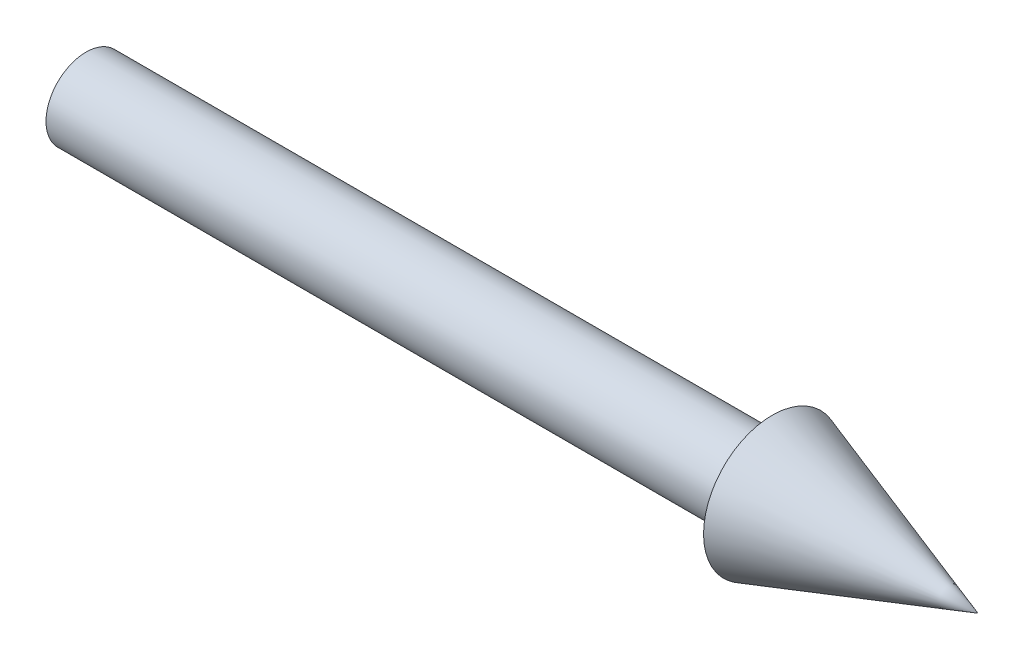
ISO-10303-21;
HEADER;
FILE_DESCRIPTION(('STEP AP214'),'2;1');
FILE_NAME('part.step','',(''),(''),'','','');
FILE_SCHEMA(('AUTOMOTIVE_DESIGN { 1 0 10303 214 1 1 1 1 }'));
ENDSEC;
DATA;
#1=APPLICATION_CONTEXT('core data for automotive mechanical design processes');
#2=APPLICATION_PROTOCOL_DEFINITION('international standard','automotive_design',2000,#1);
#3=PRODUCT_CONTEXT('',#1,'mechanical');
#4=PRODUCT('Part','Part','',(#3));
#5=PRODUCT_RELATED_PRODUCT_CATEGORY('part','',(#4));
#6=PRODUCT_DEFINITION_FORMATION('','',#4);
#7=PRODUCT_DEFINITION_CONTEXT('part definition',#1,'design');
#8=PRODUCT_DEFINITION('design','',#6,#7);
#9=PRODUCT_DEFINITION_SHAPE('','',#8);
#10=(LENGTH_UNIT() NAMED_UNIT(*) SI_UNIT(.MILLI.,.METRE.));
#11=(NAMED_UNIT(*) PLANE_ANGLE_UNIT() SI_UNIT($,.RADIAN.));
#12=(NAMED_UNIT(*) SI_UNIT($,.STERADIAN.) SOLID_ANGLE_UNIT());
#13=UNCERTAINTY_MEASURE_WITH_UNIT(LENGTH_MEASURE(1.E-05),#10,'distance_accuracy_value','');
#14=(GEOMETRIC_REPRESENTATION_CONTEXT(3) GLOBAL_UNCERTAINTY_ASSIGNED_CONTEXT((#13)) GLOBAL_UNIT_ASSIGNED_CONTEXT((#10,
#11,#12)) REPRESENTATION_CONTEXT('',''));
#15=CARTESIAN_POINT('',(0.,0.,0.));
#16=DIRECTION('',(0.,0.,1.));
#17=DIRECTION('',(1.,0.,0.));
#18=AXIS2_PLACEMENT_3D('',#15,#16,#17);
#19=CARTESIAN_POINT('',(0.,0.,0.));
#20=DIRECTION('',(-1.,0.,0.));
#21=DIRECTION('',(0.,0.,1.));
#22=AXIS2_PLACEMENT_3D('',#19,#20,#21);
#23=PLANE('',#22);
#24=CARTESIAN_POINT('',(0.,0.,0.));
#25=DIRECTION('',(-1.,0.,0.));
#26=DIRECTION('',(0.,0.,1.));
#27=AXIS2_PLACEMENT_3D('',#24,#25,#26);
#28=CIRCLE('',#27,3.5);
#29=CARTESIAN_POINT('',(0.,0.,3.5));
#30=VERTEX_POINT('',#29);
#31=EDGE_CURVE('E11',#30,#30,#28,.T.);
#32=ORIENTED_EDGE('',*,*,#31,.T.);
#33=EDGE_LOOP('',(#32));
#34=FACE_BOUND('',#33,.T.);
#35=ADVANCED_FACE('F41',(#34),#23,.T.);
#36=CARTESIAN_POINT('',(0.,0.,0.));
#37=DIRECTION('',(-1.,0.,0.));
#38=DIRECTION('',(0.,0.,1.));
#39=AXIS2_PLACEMENT_3D('',#36,#37,#38);
#40=CYLINDRICAL_SURFACE('',#39,3.5);
#41=CARTESIAN_POINT('',(60.,0.,0.));
#42=DIRECTION('',(-1.,0.,0.));
#43=DIRECTION('',(0.,0.,1.));
#44=AXIS2_PLACEMENT_3D('',#41,#42,#43);
#45=CIRCLE('',#44,3.5);
#46=CARTESIAN_POINT('',(60.,0.,3.5));
#47=VERTEX_POINT('',#46);
#48=EDGE_CURVE('E48',#47,#47,#45,.T.);
#49=ORIENTED_EDGE('',*,*,#48,.T.);
#50=EDGE_LOOP('',(#49));
#51=FACE_BOUND('',#50,.T.);
#52=ORIENTED_EDGE('',*,*,#31,.F.);
#53=EDGE_LOOP('',(#52));
#54=FACE_BOUND('',#53,.T.);
#55=ADVANCED_FACE('F66',(#51,#54),#40,.T.);
#56=CARTESIAN_POINT('',(60.,0.,3.5));
#57=DIRECTION('',(-1.,0.,0.));
#58=DIRECTION('',(0.,0.,1.));
#59=AXIS2_PLACEMENT_3D('',#56,#57,#58);
#60=PLANE('',#59);
#61=CARTESIAN_POINT('',(60.,0.,0.));
#62=DIRECTION('',(-1.,0.,0.));
#63=DIRECTION('',(0.,0.,1.));
#64=AXIS2_PLACEMENT_3D('',#61,#62,#63);
#65=CIRCLE('',#64,6.);
#66=CARTESIAN_POINT('',(60.,0.,6.));
#67=VERTEX_POINT('',#66);
#68=EDGE_CURVE('E58',#67,#67,#65,.T.);
#69=ORIENTED_EDGE('',*,*,#68,.T.);
#70=EDGE_LOOP('',(#69));
#71=FACE_BOUND('',#70,.T.);
#72=ORIENTED_EDGE('',*,*,#48,.F.);
#73=EDGE_LOOP('',(#72));
#74=FACE_BOUND('',#73,.T.);
#75=ADVANCED_FACE('F54',(#71,#74),#60,.T.);
#76=CARTESIAN_POINT('',(60.,0.,0.));
#77=DIRECTION('',(-1.,0.,0.));
#78=DIRECTION('',(0.,0.,1.));
#79=AXIS2_PLACEMENT_3D('',#76,#77,#78);
#80=CONICAL_SURFACE('',#79,6.,0.321750554396642);
#81=CARTESIAN_POINT('',(78.,0.,0.));
#82=VERTEX_POINT('',#81);
#83=VERTEX_LOOP('',#82);
#84=FACE_BOUND('',#83,.T.);
#85=ORIENTED_EDGE('',*,*,#68,.F.);
#86=EDGE_LOOP('',(#85));
#87=FACE_BOUND('',#86,.T.);
#88=ADVANCED_FACE('F51',(#84,#87),#80,.T.);
#89=CLOSED_SHELL('',(#35,#55,#75,#88));
#90=MANIFOLD_SOLID_BREP('B2',#89);
#91=ADVANCED_BREP_SHAPE_REPRESENTATION('',(#18,#90),#14);
#92=SHAPE_DEFINITION_REPRESENTATION(#9,#91);
ENDSEC;
END-ISO-10303-21;
